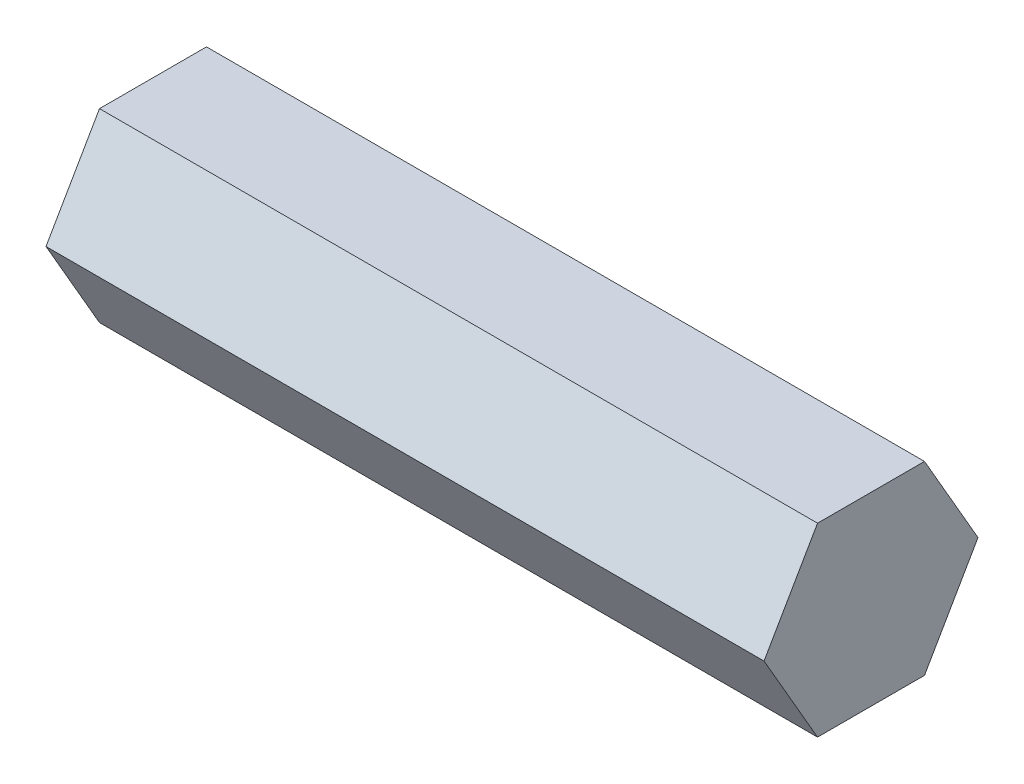
ISO-10303-21;
HEADER;
FILE_DESCRIPTION(('STEP AP214'),'2;1');
FILE_NAME('part.step','',(''),(''),'','','');
FILE_SCHEMA(('AUTOMOTIVE_DESIGN { 1 0 10303 214 1 1 1 1 }'));
ENDSEC;
DATA;
#1=APPLICATION_CONTEXT('core data for automotive mechanical design processes');
#2=APPLICATION_PROTOCOL_DEFINITION('international standard','automotive_design',2000,#1);
#3=PRODUCT_CONTEXT('',#1,'mechanical');
#4=PRODUCT('Part','Part','',(#3));
#5=PRODUCT_RELATED_PRODUCT_CATEGORY('part','',(#4));
#6=PRODUCT_DEFINITION_FORMATION('','',#4);
#7=PRODUCT_DEFINITION_CONTEXT('part definition',#1,'design');
#8=PRODUCT_DEFINITION('design','',#6,#7);
#9=PRODUCT_DEFINITION_SHAPE('','',#8);
#10=(LENGTH_UNIT() NAMED_UNIT(*) SI_UNIT(.MILLI.,.METRE.));
#11=(NAMED_UNIT(*) PLANE_ANGLE_UNIT() SI_UNIT($,.RADIAN.));
#12=(NAMED_UNIT(*) SI_UNIT($,.STERADIAN.) SOLID_ANGLE_UNIT());
#13=UNCERTAINTY_MEASURE_WITH_UNIT(LENGTH_MEASURE(1.E-05),#10,'distance_accuracy_value','');
#14=(GEOMETRIC_REPRESENTATION_CONTEXT(3) GLOBAL_UNCERTAINTY_ASSIGNED_CONTEXT((#13)) GLOBAL_UNIT_ASSIGNED_CONTEXT((#10,
#11,#12)) REPRESENTATION_CONTEXT('',''));
#15=CARTESIAN_POINT('',(0.,0.,0.));
#16=DIRECTION('',(0.,0.,1.));
#17=DIRECTION('',(1.,0.,0.));
#18=AXIS2_PLACEMENT_3D('',#15,#16,#17);
#19=CARTESIAN_POINT('',(49.2125,-6.34999999999993,-3.66617420935418));
#20=DIRECTION('',(0.,0.499999999999995,0.866025403784442));
#21=DIRECTION('',(0.,-0.866025403784442,0.499999999999995));
#22=AXIS2_PLACEMENT_3D('',#19,#20,#21);
#23=PLANE('',#22);
#24=DIRECTION('',(0.,0.866025403784441,-0.499999999999995));
#25=VECTOR('',#24,1.);
#26=CARTESIAN_POINT('',(0.,-6.34999999999993,-3.66617420935418));
#27=LINE('',#26,#25);
#28=CARTESIAN_POINT('',(0.,-6.34999999999993,-3.66617420935418));
#29=VERTEX_POINT('',#28);
#30=CARTESIAN_POINT('',(0.,0.,-7.33234841870822));
#31=VERTEX_POINT('',#30);
#32=EDGE_CURVE('E116',#29,#31,#27,.T.);
#33=ORIENTED_EDGE('',*,*,#32,.T.);
#34=DIRECTION('',(-1.,0.,0.));
#35=VECTOR('',#34,1.);
#36=CARTESIAN_POINT('',(49.2125,0.,-7.33234841870822));
#37=LINE('',#36,#35);
#38=CARTESIAN_POINT('',(49.2125,0.,-7.33234841870822));
#39=VERTEX_POINT('',#38);
#40=EDGE_CURVE('E11',#39,#31,#37,.T.);
#41=ORIENTED_EDGE('',*,*,#40,.F.);
#42=DIRECTION('',(0.,0.866025403784441,-0.499999999999995));
#43=VECTOR('',#42,1.);
#44=CARTESIAN_POINT('',(49.2125,-6.34999999999993,-3.66617420935418));
#45=LINE('',#44,#43);
#46=CARTESIAN_POINT('',(49.2125,-6.34999999999993,-3.66617420935418));
#47=VERTEX_POINT('',#46);
#48=EDGE_CURVE('E126',#47,#39,#45,.T.);
#49=ORIENTED_EDGE('',*,*,#48,.F.);
#50=DIRECTION('',(-1.,0.,0.));
#51=VECTOR('',#50,1.);
#52=CARTESIAN_POINT('',(49.2125,-6.34999999999993,-3.66617420935418));
#53=LINE('',#52,#51);
#54=EDGE_CURVE('E112',#47,#29,#53,.T.);
#55=ORIENTED_EDGE('',*,*,#54,.T.);
#56=EDGE_LOOP('',(#33,#41,#49,#55));
#57=FACE_BOUND('',#56,.T.);
#58=ADVANCED_FACE('F32',(#57),#23,.F.);
#59=CARTESIAN_POINT('',(49.2125,0.,-7.33234841870822));
#60=DIRECTION('',(0.,-0.500000000000001,0.866025403784438));
#61=DIRECTION('',(0.,-0.866025403784438,-0.500000000000001));
#62=AXIS2_PLACEMENT_3D('',#59,#60,#61);
#63=PLANE('',#62);
#64=DIRECTION('',(0.,0.866025403784438,0.500000000000001));
#65=VECTOR('',#64,1.);
#66=CARTESIAN_POINT('',(0.,0.,-7.33234841870822));
#67=LINE('',#66,#65);
#68=CARTESIAN_POINT('',(0.,6.34999999999999,-3.6661742093541));
#69=VERTEX_POINT('',#68);
#70=EDGE_CURVE('E119',#31,#69,#67,.T.);
#71=ORIENTED_EDGE('',*,*,#70,.T.);
#72=DIRECTION('',(-1.,0.,0.));
#73=VECTOR('',#72,1.);
#74=CARTESIAN_POINT('',(49.2125,6.34999999999999,-3.6661742093541));
#75=LINE('',#74,#73);
#76=CARTESIAN_POINT('',(49.2125,6.34999999999999,-3.6661742093541));
#77=VERTEX_POINT('',#76);
#78=EDGE_CURVE('E40',#77,#69,#75,.T.);
#79=ORIENTED_EDGE('',*,*,#78,.F.);
#80=DIRECTION('',(0.,0.866025403784438,0.500000000000001));
#81=VECTOR('',#80,1.);
#82=CARTESIAN_POINT('',(49.2125,0.,-7.33234841870822));
#83=LINE('',#82,#81);
#84=EDGE_CURVE('E85',#39,#77,#83,.T.);
#85=ORIENTED_EDGE('',*,*,#84,.F.);
#86=ORIENTED_EDGE('',*,*,#40,.T.);
#87=EDGE_LOOP('',(#71,#79,#85,#86));
#88=FACE_BOUND('',#87,.T.);
#89=ADVANCED_FACE('F150',(#88),#63,.F.);
#90=CARTESIAN_POINT('',(49.2125,6.34999999999999,-3.6661742093541));
#91=DIRECTION('',(0.,-1.,0.));
#92=DIRECTION('',(0.,0.,-1.));
#93=AXIS2_PLACEMENT_3D('',#90,#91,#92);
#94=PLANE('',#93);
#95=DIRECTION('',(0.,0.,1.));
#96=VECTOR('',#95,1.);
#97=CARTESIAN_POINT('',(0.,6.34999999999999,-3.6661742093541));
#98=LINE('',#97,#96);
#99=CARTESIAN_POINT('',(0.,6.34999999999996,3.66617420935414));
#100=VERTEX_POINT('',#99);
#101=EDGE_CURVE('E121',#69,#100,#98,.T.);
#102=ORIENTED_EDGE('',*,*,#101,.T.);
#103=DIRECTION('',(-1.,0.,0.));
#104=VECTOR('',#103,1.);
#105=CARTESIAN_POINT('',(49.2125,6.34999999999996,3.66617420935414));
#106=LINE('',#105,#104);
#107=CARTESIAN_POINT('',(49.2125,6.34999999999996,3.66617420935414));
#108=VERTEX_POINT('',#107);
#109=EDGE_CURVE('E107',#108,#100,#106,.T.);
#110=ORIENTED_EDGE('',*,*,#109,.F.);
#111=DIRECTION('',(0.,0.,1.));
#112=VECTOR('',#111,1.);
#113=CARTESIAN_POINT('',(49.2125,6.34999999999999,-3.6661742093541));
#114=LINE('',#113,#112);
#115=EDGE_CURVE('E98',#77,#108,#114,.T.);
#116=ORIENTED_EDGE('',*,*,#115,.F.);
#117=ORIENTED_EDGE('',*,*,#78,.T.);
#118=EDGE_LOOP('',(#102,#110,#116,#117));
#119=FACE_BOUND('',#118,.T.);
#120=ADVANCED_FACE('F132',(#119),#94,.F.);
#121=CARTESIAN_POINT('',(49.2125,6.34999999999996,3.66617420935414));
#122=DIRECTION('',(0.,-0.499999999999995,-0.866025403784442));
#123=DIRECTION('',(0.,0.866025403784442,-0.499999999999995));
#124=AXIS2_PLACEMENT_3D('',#121,#122,#123);
#125=PLANE('',#124);
#126=DIRECTION('',(0.,-0.866025403784441,0.499999999999995));
#127=VECTOR('',#126,1.);
#128=CARTESIAN_POINT('',(0.,6.34999999999996,3.66617420935414));
#129=LINE('',#128,#127);
#130=CARTESIAN_POINT('',(0.,0.,7.33234841870822));
#131=VERTEX_POINT('',#130);
#132=EDGE_CURVE('E106',#100,#131,#129,.T.);
#133=ORIENTED_EDGE('',*,*,#132,.T.);
#134=DIRECTION('',(-1.,0.,0.));
#135=VECTOR('',#134,1.);
#136=CARTESIAN_POINT('',(49.2125,0.,7.33234841870822));
#137=LINE('',#136,#135);
#138=CARTESIAN_POINT('',(49.2125,0.,7.33234841870822));
#139=VERTEX_POINT('',#138);
#140=EDGE_CURVE('E103',#139,#131,#137,.T.);
#141=ORIENTED_EDGE('',*,*,#140,.F.);
#142=DIRECTION('',(0.,-0.866025403784441,0.499999999999995));
#143=VECTOR('',#142,1.);
#144=CARTESIAN_POINT('',(49.2125,6.34999999999996,3.66617420935414));
#145=LINE('',#144,#143);
#146=EDGE_CURVE('E92',#108,#139,#145,.T.);
#147=ORIENTED_EDGE('',*,*,#146,.F.);
#148=ORIENTED_EDGE('',*,*,#109,.T.);
#149=EDGE_LOOP('',(#133,#141,#147,#148));
#150=FACE_BOUND('',#149,.T.);
#151=ADVANCED_FACE('F104',(#150),#125,.F.);
#152=CARTESIAN_POINT('',(49.2125,0.,7.33234841870822));
#153=DIRECTION('',(0.,0.500000000000007,-0.866025403784435));
#154=DIRECTION('',(0.,0.866025403784435,0.500000000000007));
#155=AXIS2_PLACEMENT_3D('',#152,#153,#154);
#156=PLANE('',#155);
#157=DIRECTION('',(0.,-0.866025403784434,-0.500000000000007));
#158=VECTOR('',#157,1.);
#159=CARTESIAN_POINT('',(0.,0.,7.33234841870822));
#160=LINE('',#159,#158);
#161=CARTESIAN_POINT('',(0.,-6.35000000000001,3.66617420935405));
#162=VERTEX_POINT('',#161);
#163=EDGE_CURVE('E71',#131,#162,#160,.T.);
#164=ORIENTED_EDGE('',*,*,#163,.T.);
#165=DIRECTION('',(-1.,0.,0.));
#166=VECTOR('',#165,1.);
#167=CARTESIAN_POINT('',(49.2125,-6.35000000000001,3.66617420935405));
#168=LINE('',#167,#166);
#169=CARTESIAN_POINT('',(49.2125,-6.35000000000001,3.66617420935405));
#170=VERTEX_POINT('',#169);
#171=EDGE_CURVE('E108',#170,#162,#168,.T.);
#172=ORIENTED_EDGE('',*,*,#171,.F.);
#173=DIRECTION('',(0.,-0.866025403784434,-0.500000000000007));
#174=VECTOR('',#173,1.);
#175=CARTESIAN_POINT('',(49.2125,0.,7.33234841870822));
#176=LINE('',#175,#174);
#177=EDGE_CURVE('E96',#139,#170,#176,.T.);
#178=ORIENTED_EDGE('',*,*,#177,.F.);
#179=ORIENTED_EDGE('',*,*,#140,.T.);
#180=EDGE_LOOP('',(#164,#172,#178,#179));
#181=FACE_BOUND('',#180,.T.);
#182=ADVANCED_FACE('F110',(#181),#156,.F.);
#183=CARTESIAN_POINT('',(49.2125,-6.35000000000001,3.66617420935405));
#184=DIRECTION('',(0.,1.,0.));
#185=DIRECTION('',(0.,0.,1.));
#186=AXIS2_PLACEMENT_3D('',#183,#184,#185);
#187=PLANE('',#186);
#188=DIRECTION('',(0.,0.,-1.));
#189=VECTOR('',#188,1.);
#190=CARTESIAN_POINT('',(0.,-6.35000000000001,3.66617420935405));
#191=LINE('',#190,#189);
#192=EDGE_CURVE('E77',#162,#29,#191,.T.);
#193=ORIENTED_EDGE('',*,*,#192,.T.);
#194=ORIENTED_EDGE('',*,*,#54,.F.);
#195=DIRECTION('',(0.,0.,-1.));
#196=VECTOR('',#195,1.);
#197=CARTESIAN_POINT('',(49.2125,-6.35000000000001,3.66617420935405));
#198=LINE('',#197,#196);
#199=EDGE_CURVE('E48',#170,#47,#198,.T.);
#200=ORIENTED_EDGE('',*,*,#199,.F.);
#201=ORIENTED_EDGE('',*,*,#171,.T.);
#202=EDGE_LOOP('',(#193,#194,#200,#201));
#203=FACE_BOUND('',#202,.T.);
#204=ADVANCED_FACE('F139',(#203),#187,.F.);
#205=CARTESIAN_POINT('',(49.2125,0.,0.));
#206=DIRECTION('',(1.,0.,0.));
#207=DIRECTION('',(0.,0.,-1.));
#208=AXIS2_PLACEMENT_3D('',#205,#206,#207);
#209=PLANE('',#208);
#210=ORIENTED_EDGE('',*,*,#48,.T.);
#211=ORIENTED_EDGE('',*,*,#84,.T.);
#212=ORIENTED_EDGE('',*,*,#115,.T.);
#213=ORIENTED_EDGE('',*,*,#146,.T.);
#214=ORIENTED_EDGE('',*,*,#177,.T.);
#215=ORIENTED_EDGE('',*,*,#199,.T.);
#216=EDGE_LOOP('',(#210,#211,#212,#213,#214,#215));
#217=FACE_BOUND('',#216,.T.);
#218=ADVANCED_FACE('F94',(#217),#209,.T.);
#219=CARTESIAN_POINT('',(0.,0.,0.));
#220=DIRECTION('',(1.,0.,0.));
#221=DIRECTION('',(0.,0.,-1.));
#222=AXIS2_PLACEMENT_3D('',#219,#220,#221);
#223=PLANE('',#222);
#224=ORIENTED_EDGE('',*,*,#32,.F.);
#225=ORIENTED_EDGE('',*,*,#192,.F.);
#226=ORIENTED_EDGE('',*,*,#163,.F.);
#227=ORIENTED_EDGE('',*,*,#132,.F.);
#228=ORIENTED_EDGE('',*,*,#101,.F.);
#229=ORIENTED_EDGE('',*,*,#70,.F.);
#230=EDGE_LOOP('',(#224,#225,#226,#227,#228,#229));
#231=FACE_BOUND('',#230,.T.);
#232=ADVANCED_FACE('F135',(#231),#223,.F.);
#233=CLOSED_SHELL('',(#58,#89,#120,#151,#182,#204,#218,#232));
#234=MANIFOLD_SOLID_BREP('B2',#233);
#235=ADVANCED_BREP_SHAPE_REPRESENTATION('',(#18,#234),#14);
#236=SHAPE_DEFINITION_REPRESENTATION(#9,#235);
ENDSEC;
END-ISO-10303-21;
